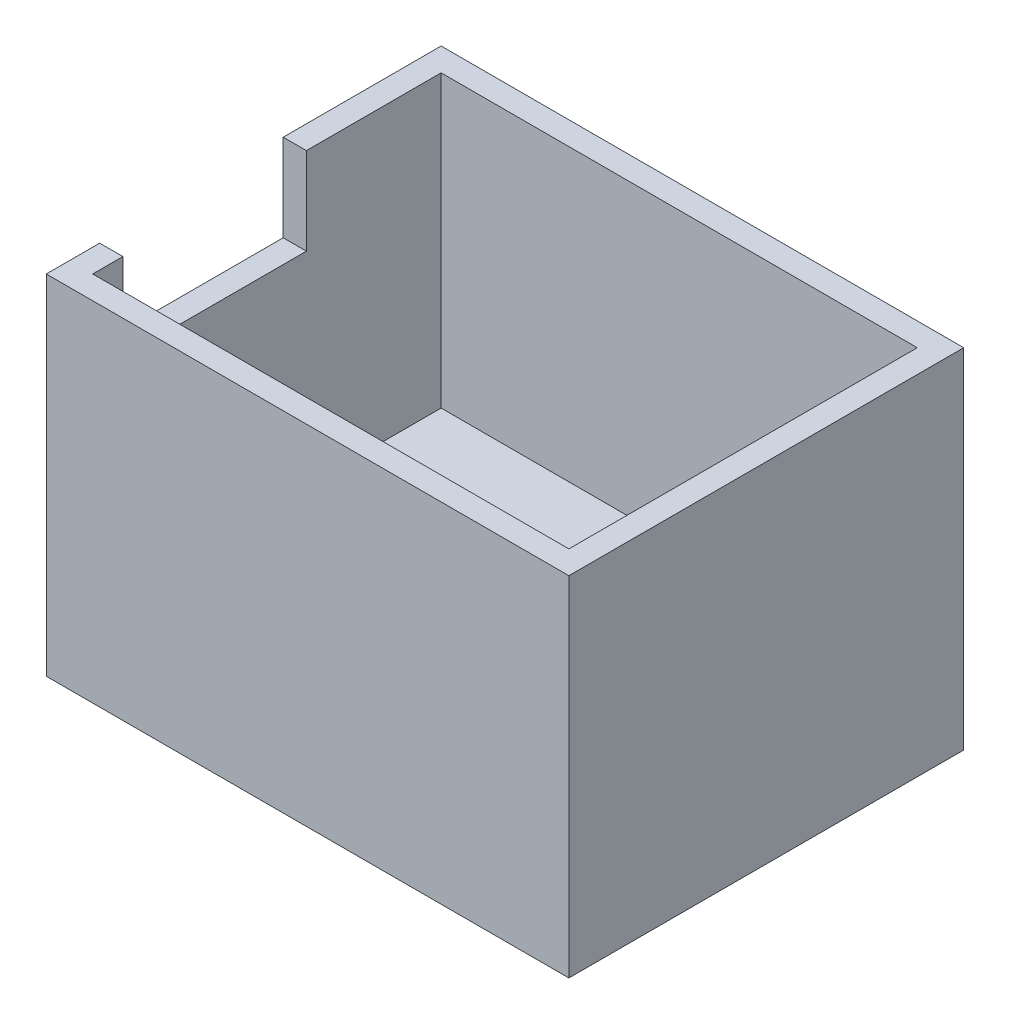
ISO-10303-21;
HEADER;
FILE_DESCRIPTION(('STEP AP214'),'2;1');
FILE_NAME('part.step','',(''),(''),'','','');
FILE_SCHEMA(('AUTOMOTIVE_DESIGN { 1 0 10303 214 1 1 1 1 }'));
ENDSEC;
DATA;
#1=APPLICATION_CONTEXT('core data for automotive mechanical design processes');
#2=APPLICATION_PROTOCOL_DEFINITION('international standard','automotive_design',2000,#1);
#3=PRODUCT_CONTEXT('',#1,'mechanical');
#4=PRODUCT('Part','Part','',(#3));
#5=PRODUCT_RELATED_PRODUCT_CATEGORY('part','',(#4));
#6=PRODUCT_DEFINITION_FORMATION('','',#4);
#7=PRODUCT_DEFINITION_CONTEXT('part definition',#1,'design');
#8=PRODUCT_DEFINITION('design','',#6,#7);
#9=PRODUCT_DEFINITION_SHAPE('','',#8);
#10=(LENGTH_UNIT() NAMED_UNIT(*) SI_UNIT(.MILLI.,.METRE.));
#11=(NAMED_UNIT(*) PLANE_ANGLE_UNIT() SI_UNIT($,.RADIAN.));
#12=(NAMED_UNIT(*) SI_UNIT($,.STERADIAN.) SOLID_ANGLE_UNIT());
#13=UNCERTAINTY_MEASURE_WITH_UNIT(LENGTH_MEASURE(1.E-05),#10,'distance_accuracy_value','');
#14=(GEOMETRIC_REPRESENTATION_CONTEXT(3) GLOBAL_UNCERTAINTY_ASSIGNED_CONTEXT((#13)) GLOBAL_UNIT_ASSIGNED_CONTEXT((#10,
#11,#12)) REPRESENTATION_CONTEXT('',''));
#15=CARTESIAN_POINT('',(0.,0.,0.));
#16=DIRECTION('',(0.,0.,1.));
#17=DIRECTION('',(1.,0.,0.));
#18=AXIS2_PLACEMENT_3D('',#15,#16,#17);
#19=CARTESIAN_POINT('',(28.575,38.1,21.59));
#20=DIRECTION('',(-1.,0.,0.));
#21=DIRECTION('',(0.,0.,1.));
#22=AXIS2_PLACEMENT_3D('',#19,#20,#21);
#23=PLANE('',#22);
#24=DIRECTION('',(0.,0.,-1.));
#25=VECTOR('',#24,1.);
#26=CARTESIAN_POINT('',(28.575,0.,21.59));
#27=LINE('',#26,#25);
#28=CARTESIAN_POINT('',(28.575,0.,21.59));
#29=VERTEX_POINT('',#28);
#30=CARTESIAN_POINT('',(28.575,0.,-21.59));
#31=VERTEX_POINT('',#30);
#32=EDGE_CURVE('E300',#29,#31,#27,.T.);
#33=ORIENTED_EDGE('',*,*,#32,.T.);
#34=DIRECTION('',(0.,-1.,0.));
#35=VECTOR('',#34,1.);
#36=CARTESIAN_POINT('',(28.575,38.1,-21.59));
#37=LINE('',#36,#35);
#38=CARTESIAN_POINT('',(28.575,38.1,-21.59));
#39=VERTEX_POINT('',#38);
#40=EDGE_CURVE('E335',#39,#31,#37,.T.);
#41=ORIENTED_EDGE('',*,*,#40,.F.);
#42=DIRECTION('',(0.,0.,-1.));
#43=VECTOR('',#42,1.);
#44=CARTESIAN_POINT('',(28.575,38.1,21.59));
#45=LINE('',#44,#43);
#46=CARTESIAN_POINT('',(28.575,38.1,21.59));
#47=VERTEX_POINT('',#46);
#48=EDGE_CURVE('E307',#47,#39,#45,.T.);
#49=ORIENTED_EDGE('',*,*,#48,.F.);
#50=DIRECTION('',(0.,-1.,0.));
#51=VECTOR('',#50,1.);
#52=CARTESIAN_POINT('',(28.575,38.1,21.59));
#53=LINE('',#52,#51);
#54=EDGE_CURVE('E319',#47,#29,#53,.T.);
#55=ORIENTED_EDGE('',*,*,#54,.T.);
#56=EDGE_LOOP('',(#33,#41,#49,#55));
#57=FACE_BOUND('',#56,.T.);
#58=ADVANCED_FACE('F34',(#57),#23,.F.);
#59=CARTESIAN_POINT('',(-28.575,38.1,-21.59));
#60=DIRECTION('',(0.,0.,1.));
#61=DIRECTION('',(1.,0.,0.));
#62=AXIS2_PLACEMENT_3D('',#59,#60,#61);
#63=PLANE('',#62);
#64=DIRECTION('',(-1.,0.,0.));
#65=VECTOR('',#64,1.);
#66=CARTESIAN_POINT('',(-28.575,0.,-21.59));
#67=LINE('',#66,#65);
#68=CARTESIAN_POINT('',(-28.575,0.,-21.59));
#69=VERTEX_POINT('',#68);
#70=EDGE_CURVE('E322',#31,#69,#67,.T.);
#71=ORIENTED_EDGE('',*,*,#70,.T.);
#72=DIRECTION('',(0.,-1.,0.));
#73=VECTOR('',#72,1.);
#74=CARTESIAN_POINT('',(-28.575,38.1,-21.59));
#75=LINE('',#74,#73);
#76=CARTESIAN_POINT('',(-28.575,38.1,-21.59));
#77=VERTEX_POINT('',#76);
#78=EDGE_CURVE('E332',#77,#69,#75,.T.);
#79=ORIENTED_EDGE('',*,*,#78,.F.);
#80=DIRECTION('',(-1.,0.,0.));
#81=VECTOR('',#80,1.);
#82=CARTESIAN_POINT('',(-28.575,38.1,-21.59));
#83=LINE('',#82,#81);
#84=EDGE_CURVE('E310',#39,#77,#83,.T.);
#85=ORIENTED_EDGE('',*,*,#84,.F.);
#86=ORIENTED_EDGE('',*,*,#40,.T.);
#87=EDGE_LOOP('',(#71,#79,#85,#86));
#88=FACE_BOUND('',#87,.T.);
#89=ADVANCED_FACE('F399',(#88),#63,.F.);
#90=CARTESIAN_POINT('',(-28.575,38.1,21.59));
#91=DIRECTION('',(1.,0.,0.));
#92=DIRECTION('',(0.,0.,-1.));
#93=AXIS2_PLACEMENT_3D('',#90,#91,#92);
#94=PLANE('',#93);
#95=DIRECTION('',(0.,0.,1.));
#96=VECTOR('',#95,1.);
#97=CARTESIAN_POINT('',(-28.575,38.1,21.59));
#98=LINE('',#97,#96);
#99=CARTESIAN_POINT('',(-28.575,38.1,15.748));
#100=VERTEX_POINT('',#99);
#101=CARTESIAN_POINT('',(-28.575,38.1,21.59));
#102=VERTEX_POINT('',#101);
#103=EDGE_CURVE('E313',#100,#102,#98,.T.);
#104=ORIENTED_EDGE('',*,*,#103,.F.);
#105=DIRECTION('',(0.,1.,0.));
#106=VECTOR('',#105,1.);
#107=CARTESIAN_POINT('',(-28.575,38.1,15.748));
#108=LINE('',#107,#106);
#109=CARTESIAN_POINT('',(-28.575,28.575,15.748));
#110=VERTEX_POINT('',#109);
#111=EDGE_CURVE('E235',#110,#100,#108,.T.);
#112=ORIENTED_EDGE('',*,*,#111,.F.);
#113=DIRECTION('',(0.,0.,1.));
#114=VECTOR('',#113,1.);
#115=CARTESIAN_POINT('',(-28.575,28.575,15.748));
#116=LINE('',#115,#114);
#117=CARTESIAN_POINT('',(-28.575,28.575,-4.318));
#118=VERTEX_POINT('',#117);
#119=EDGE_CURVE('E240',#118,#110,#116,.T.);
#120=ORIENTED_EDGE('',*,*,#119,.F.);
#121=DIRECTION('',(0.,-1.,0.));
#122=VECTOR('',#121,1.);
#123=CARTESIAN_POINT('',(-28.575,38.1,-4.318));
#124=LINE('',#123,#122);
#125=CARTESIAN_POINT('',(-28.575,38.1,-4.318));
#126=VERTEX_POINT('',#125);
#127=EDGE_CURVE('E237',#126,#118,#124,.T.);
#128=ORIENTED_EDGE('',*,*,#127,.F.);
#129=EDGE_CURVE('E314',#77,#126,#98,.T.);
#130=ORIENTED_EDGE('',*,*,#129,.F.);
#131=ORIENTED_EDGE('',*,*,#78,.T.);
#132=DIRECTION('',(0.,0.,1.));
#133=VECTOR('',#132,1.);
#134=CARTESIAN_POINT('',(-28.575,0.,21.59));
#135=LINE('',#134,#133);
#136=CARTESIAN_POINT('',(-28.575,0.,21.59));
#137=VERTEX_POINT('',#136);
#138=EDGE_CURVE('E324',#69,#137,#135,.T.);
#139=ORIENTED_EDGE('',*,*,#138,.T.);
#140=DIRECTION('',(0.,-1.,0.));
#141=VECTOR('',#140,1.);
#142=CARTESIAN_POINT('',(-28.575,38.1,21.59));
#143=LINE('',#142,#141);
#144=EDGE_CURVE('E329',#102,#137,#143,.T.);
#145=ORIENTED_EDGE('',*,*,#144,.F.);
#146=EDGE_LOOP('',(#104,#112,#120,#128,#130,#131,#139,#145));
#147=FACE_BOUND('',#146,.T.);
#148=ADVANCED_FACE('F404',(#147),#94,.F.);
#149=CARTESIAN_POINT('',(-28.575,38.1,21.59));
#150=DIRECTION('',(0.,0.,-1.));
#151=DIRECTION('',(-1.,0.,0.));
#152=AXIS2_PLACEMENT_3D('',#149,#150,#151);
#153=PLANE('',#152);
#154=DIRECTION('',(1.,0.,0.));
#155=VECTOR('',#154,1.);
#156=CARTESIAN_POINT('',(-28.575,0.,21.59));
#157=LINE('',#156,#155);
#158=EDGE_CURVE('E311',#137,#29,#157,.T.);
#159=ORIENTED_EDGE('',*,*,#158,.T.);
#160=ORIENTED_EDGE('',*,*,#54,.F.);
#161=DIRECTION('',(1.,0.,0.));
#162=VECTOR('',#161,1.);
#163=CARTESIAN_POINT('',(-28.575,38.1,21.59));
#164=LINE('',#163,#162);
#165=EDGE_CURVE('E317',#102,#47,#164,.T.);
#166=ORIENTED_EDGE('',*,*,#165,.F.);
#167=ORIENTED_EDGE('',*,*,#144,.T.);
#168=EDGE_LOOP('',(#159,#160,#166,#167));
#169=FACE_BOUND('',#168,.T.);
#170=ADVANCED_FACE('F422',(#169),#153,.F.);
#171=CARTESIAN_POINT('',(0.,38.1,0.));
#172=DIRECTION('',(0.,-1.,0.));
#173=DIRECTION('',(0.,0.,-1.));
#174=AXIS2_PLACEMENT_3D('',#171,#172,#173);
#175=PLANE('',#174);
#176=DIRECTION('',(0.,0.,1.));
#177=VECTOR('',#176,1.);
#178=CARTESIAN_POINT('',(-26.035,38.1,19.05));
#179=LINE('',#178,#177);
#180=CARTESIAN_POINT('',(-26.035,38.1,15.748));
#181=VERTEX_POINT('',#180);
#182=CARTESIAN_POINT('',(-26.035,38.1,19.05));
#183=VERTEX_POINT('',#182);
#184=EDGE_CURVE('E266',#181,#183,#179,.T.);
#185=ORIENTED_EDGE('',*,*,#184,.F.);
#186=DIRECTION('',(-1.,0.,0.));
#187=VECTOR('',#186,1.);
#188=CARTESIAN_POINT('',(28.576,38.1,15.748));
#189=LINE('',#188,#187);
#190=EDGE_CURVE('E243',#181,#100,#189,.T.);
#191=ORIENTED_EDGE('',*,*,#190,.T.);
#192=ORIENTED_EDGE('',*,*,#103,.T.);
#193=ORIENTED_EDGE('',*,*,#165,.T.);
#194=ORIENTED_EDGE('',*,*,#48,.T.);
#195=ORIENTED_EDGE('',*,*,#84,.T.);
#196=ORIENTED_EDGE('',*,*,#129,.T.);
#197=DIRECTION('',(-1.,0.,0.));
#198=VECTOR('',#197,1.);
#199=CARTESIAN_POINT('',(28.576,38.1,-4.318));
#200=LINE('',#199,#198);
#201=CARTESIAN_POINT('',(-26.035,38.1,-4.318));
#202=VERTEX_POINT('',#201);
#203=EDGE_CURVE('E249',#202,#126,#200,.T.);
#204=ORIENTED_EDGE('',*,*,#203,.F.);
#205=CARTESIAN_POINT('',(-26.035,38.1,-19.05));
#206=VERTEX_POINT('',#205);
#207=EDGE_CURVE('E287',#206,#202,#179,.T.);
#208=ORIENTED_EDGE('',*,*,#207,.F.);
#209=DIRECTION('',(-1.,0.,0.));
#210=VECTOR('',#209,1.);
#211=CARTESIAN_POINT('',(26.035,38.1,-19.05));
#212=LINE('',#211,#210);
#213=CARTESIAN_POINT('',(26.035,38.1,-19.05));
#214=VERTEX_POINT('',#213);
#215=EDGE_CURVE('E277',#214,#206,#212,.T.);
#216=ORIENTED_EDGE('',*,*,#215,.F.);
#217=DIRECTION('',(0.,0.,-1.));
#218=VECTOR('',#217,1.);
#219=CARTESIAN_POINT('',(26.035,38.1,19.05));
#220=LINE('',#219,#218);
#221=CARTESIAN_POINT('',(26.035,38.1,19.05));
#222=VERTEX_POINT('',#221);
#223=EDGE_CURVE('E293',#222,#214,#220,.T.);
#224=ORIENTED_EDGE('',*,*,#223,.F.);
#225=DIRECTION('',(1.,0.,0.));
#226=VECTOR('',#225,1.);
#227=CARTESIAN_POINT('',(26.035,38.1,19.05));
#228=LINE('',#227,#226);
#229=EDGE_CURVE('E290',#183,#222,#228,.T.);
#230=ORIENTED_EDGE('',*,*,#229,.F.);
#231=EDGE_LOOP('',(#185,#191,#192,#193,#194,#195,#196,#204,#208,#216,#224,#230));
#232=FACE_BOUND('',#231,.T.);
#233=ADVANCED_FACE('F417',(#232),#175,.F.);
#234=CARTESIAN_POINT('',(0.,0.,0.));
#235=DIRECTION('',(0.,-1.,0.));
#236=DIRECTION('',(0.,0.,-1.));
#237=AXIS2_PLACEMENT_3D('',#234,#235,#236);
#238=PLANE('',#237);
#239=CARTESIAN_POINT('',(-3.175,0.,-14.605));
#240=DIRECTION('',(0.,-1.,0.));
#241=DIRECTION('',(0.,0.,-1.));
#242=AXIS2_PLACEMENT_3D('',#239,#240,#241);
#243=CIRCLE('',#242,1.82879999999999);
#244=CARTESIAN_POINT('',(-3.175,0.,-16.4338));
#245=VERTEX_POINT('',#244);
#246=EDGE_CURVE('E364',#245,#245,#243,.T.);
#247=ORIENTED_EDGE('',*,*,#246,.F.);
#248=EDGE_LOOP('',(#247));
#249=FACE_BOUND('',#248,.T.);
#250=CARTESIAN_POINT('',(-3.175,0.,14.605));
#251=DIRECTION('',(0.,-1.,0.));
#252=DIRECTION('',(0.,0.,-1.));
#253=AXIS2_PLACEMENT_3D('',#250,#251,#252);
#254=CIRCLE('',#253,1.82879999999999);
#255=CARTESIAN_POINT('',(-3.175,0.,12.7762));
#256=VERTEX_POINT('',#255);
#257=EDGE_CURVE('E354',#256,#256,#254,.T.);
#258=ORIENTED_EDGE('',*,*,#257,.F.);
#259=EDGE_LOOP('',(#258));
#260=FACE_BOUND('',#259,.T.);
#261=CARTESIAN_POINT('',(19.656947542752,0.,-16.256));
#262=DIRECTION('',(0.,-1.,0.));
#263=DIRECTION('',(0.,0.,-1.));
#264=AXIS2_PLACEMENT_3D('',#261,#262,#263);
#265=CIRCLE('',#264,1.47319999999999);
#266=CARTESIAN_POINT('',(19.656947542752,0.,-17.7292));
#267=VERTEX_POINT('',#266);
#268=EDGE_CURVE('E351',#267,#267,#265,.T.);
#269=ORIENTED_EDGE('',*,*,#268,.F.);
#270=EDGE_LOOP('',(#269));
#271=FACE_BOUND('',#270,.T.);
#272=CARTESIAN_POINT('',(19.656947542752,0.,16.256));
#273=DIRECTION('',(0.,-1.,0.));
#274=DIRECTION('',(0.,0.,-1.));
#275=AXIS2_PLACEMENT_3D('',#272,#273,#274);
#276=CIRCLE('',#275,1.47319999999999);
#277=CARTESIAN_POINT('',(19.656947542752,0.,14.7828));
#278=VERTEX_POINT('',#277);
#279=EDGE_CURVE('E348',#278,#278,#276,.T.);
#280=ORIENTED_EDGE('',*,*,#279,.F.);
#281=EDGE_LOOP('',(#280));
#282=FACE_BOUND('',#281,.T.);
#283=DIRECTION('',(0.,0.,1.));
#284=VECTOR('',#283,1.);
#285=CARTESIAN_POINT('',(24.228947542752,0.,-13.716));
#286=LINE('',#285,#284);
#287=CARTESIAN_POINT('',(24.228947542752,0.,-13.716));
#288=VERTEX_POINT('',#287);
#289=CARTESIAN_POINT('',(24.228947542752,0.,13.716));
#290=VERTEX_POINT('',#289);
#291=EDGE_CURVE('E50',#288,#290,#286,.T.);
#292=ORIENTED_EDGE('',*,*,#291,.F.);
#293=DIRECTION('',(1.,0.,0.));
#294=VECTOR('',#293,1.);
#295=CARTESIAN_POINT('',(17.624947542752,0.,-13.716));
#296=LINE('',#295,#294);
#297=CARTESIAN_POINT('',(17.624947542752,0.,-13.716));
#298=VERTEX_POINT('',#297);
#299=EDGE_CURVE('E195',#298,#288,#296,.T.);
#300=ORIENTED_EDGE('',*,*,#299,.F.);
#301=CARTESIAN_POINT('',(17.624947542752,0.,-11.176));
#302=DIRECTION('',(0.,-1.,0.));
#303=DIRECTION('',(0.,0.,-1.));
#304=AXIS2_PLACEMENT_3D('',#301,#302,#303);
#305=CIRCLE('',#304,2.54);
#306=CARTESIAN_POINT('',(15.084947542752,0.,-11.176));
#307=VERTEX_POINT('',#306);
#308=EDGE_CURVE('E216',#307,#298,#305,.T.);
#309=ORIENTED_EDGE('',*,*,#308,.F.);
#310=DIRECTION('',(0.,0.,-1.));
#311=VECTOR('',#310,1.);
#312=CARTESIAN_POINT('',(15.084947542752,0.,-11.176));
#313=LINE('',#312,#311);
#314=CARTESIAN_POINT('',(15.084947542752,0.,11.176));
#315=VERTEX_POINT('',#314);
#316=EDGE_CURVE('E213',#315,#307,#313,.T.);
#317=ORIENTED_EDGE('',*,*,#316,.F.);
#318=CARTESIAN_POINT('',(17.624947542752,0.,11.176));
#319=DIRECTION('',(0.,-1.,0.));
#320=DIRECTION('',(0.,0.,1.));
#321=AXIS2_PLACEMENT_3D('',#318,#319,#320);
#322=CIRCLE('',#321,2.54);
#323=CARTESIAN_POINT('',(17.624947542752,0.,13.716));
#324=VERTEX_POINT('',#323);
#325=EDGE_CURVE('E210',#324,#315,#322,.T.);
#326=ORIENTED_EDGE('',*,*,#325,.F.);
#327=DIRECTION('',(-1.,0.,0.));
#328=VECTOR('',#327,1.);
#329=CARTESIAN_POINT('',(17.624947542752,0.,13.716));
#330=LINE('',#329,#328);
#331=EDGE_CURVE('E203',#290,#324,#330,.T.);
#332=ORIENTED_EDGE('',*,*,#331,.F.);
#333=EDGE_LOOP('',(#292,#300,#309,#317,#326,#332));
#334=FACE_BOUND('',#333,.T.);
#335=DIRECTION('',(0.,0.,1.));
#336=VECTOR('',#335,1.);
#337=CARTESIAN_POINT('',(10.541,0.,7.62000000000001));
#338=LINE('',#337,#336);
#339=CARTESIAN_POINT('',(10.541,0.,-7.61999999999999));
#340=VERTEX_POINT('',#339);
#341=CARTESIAN_POINT('',(10.541,0.,7.62000000000001));
#342=VERTEX_POINT('',#341);
#343=EDGE_CURVE('E246',#340,#342,#338,.T.);
#344=ORIENTED_EDGE('',*,*,#343,.F.);
#345=DIRECTION('',(1.,0.,0.));
#346=VECTOR('',#345,1.);
#347=CARTESIAN_POINT('',(-7.49299999999999,0.,-7.61999999999999));
#348=LINE('',#347,#346);
#349=CARTESIAN_POINT('',(-7.49299999999999,0.,-7.61999999999999));
#350=VERTEX_POINT('',#349);
#351=EDGE_CURVE('E260',#350,#340,#348,.T.);
#352=ORIENTED_EDGE('',*,*,#351,.F.);
#353=DIRECTION('',(0.,0.,-1.));
#354=VECTOR('',#353,1.);
#355=CARTESIAN_POINT('',(-7.49299999999999,0.,7.62));
#356=LINE('',#355,#354);
#357=CARTESIAN_POINT('',(-7.49299999999999,0.,7.62));
#358=VERTEX_POINT('',#357);
#359=EDGE_CURVE('E257',#358,#350,#356,.T.);
#360=ORIENTED_EDGE('',*,*,#359,.F.);
#361=DIRECTION('',(-1.,0.,0.));
#362=VECTOR('',#361,1.);
#363=CARTESIAN_POINT('',(-7.49299999999999,0.,7.62));
#364=LINE('',#363,#362);
#365=EDGE_CURVE('E254',#342,#358,#364,.T.);
#366=ORIENTED_EDGE('',*,*,#365,.F.);
#367=EDGE_LOOP('',(#344,#352,#360,#366));
#368=FACE_BOUND('',#367,.T.);
#369=ORIENTED_EDGE('',*,*,#32,.F.);
#370=ORIENTED_EDGE('',*,*,#158,.F.);
#371=ORIENTED_EDGE('',*,*,#138,.F.);
#372=ORIENTED_EDGE('',*,*,#70,.F.);
#373=EDGE_LOOP('',(#369,#370,#371,#372));
#374=FACE_BOUND('',#373,.T.);
#375=ADVANCED_FACE('F384',(#249,#260,#271,#282,#334,#368,#374),#238,.T.);
#376=CARTESIAN_POINT('',(-26.035,6.35,19.05));
#377=DIRECTION('',(-1.,0.,0.));
#378=DIRECTION('',(0.,0.,1.));
#379=AXIS2_PLACEMENT_3D('',#376,#377,#378);
#380=PLANE('',#379);
#381=DIRECTION('',(0.,0.,-1.));
#382=VECTOR('',#381,1.);
#383=CARTESIAN_POINT('',(-26.035,28.575,15.748));
#384=LINE('',#383,#382);
#385=CARTESIAN_POINT('',(-26.035,28.575,15.748));
#386=VERTEX_POINT('',#385);
#387=CARTESIAN_POINT('',(-26.035,28.575,-4.318));
#388=VERTEX_POINT('',#387);
#389=EDGE_CURVE('E230',#386,#388,#384,.T.);
#390=ORIENTED_EDGE('',*,*,#389,.F.);
#391=DIRECTION('',(0.,-1.,0.));
#392=VECTOR('',#391,1.);
#393=CARTESIAN_POINT('',(-26.035,38.1,15.748));
#394=LINE('',#393,#392);
#395=EDGE_CURVE('E232',#181,#386,#394,.T.);
#396=ORIENTED_EDGE('',*,*,#395,.F.);
#397=ORIENTED_EDGE('',*,*,#184,.T.);
#398=DIRECTION('',(0.,1.,0.));
#399=VECTOR('',#398,1.);
#400=CARTESIAN_POINT('',(-26.035,6.35,19.05));
#401=LINE('',#400,#399);
#402=CARTESIAN_POINT('',(-26.035,6.35,19.05));
#403=VERTEX_POINT('',#402);
#404=EDGE_CURVE('E286',#403,#183,#401,.T.);
#405=ORIENTED_EDGE('',*,*,#404,.F.);
#406=DIRECTION('',(0.,0.,1.));
#407=VECTOR('',#406,1.);
#408=CARTESIAN_POINT('',(-26.035,6.35,19.05));
#409=LINE('',#408,#407);
#410=CARTESIAN_POINT('',(-26.035,6.35,-19.05));
#411=VERTEX_POINT('',#410);
#412=EDGE_CURVE('E273',#411,#403,#409,.T.);
#413=ORIENTED_EDGE('',*,*,#412,.F.);
#414=DIRECTION('',(0.,1.,0.));
#415=VECTOR('',#414,1.);
#416=CARTESIAN_POINT('',(-26.035,6.35,-19.05));
#417=LINE('',#416,#415);
#418=EDGE_CURVE('E298',#411,#206,#417,.T.);
#419=ORIENTED_EDGE('',*,*,#418,.T.);
#420=ORIENTED_EDGE('',*,*,#207,.T.);
#421=DIRECTION('',(0.,1.,0.));
#422=VECTOR('',#421,1.);
#423=CARTESIAN_POINT('',(-26.035,38.1,-4.318));
#424=LINE('',#423,#422);
#425=EDGE_CURVE('E189',#388,#202,#424,.T.);
#426=ORIENTED_EDGE('',*,*,#425,.F.);
#427=EDGE_LOOP('',(#390,#396,#397,#405,#413,#419,#420,#426));
#428=FACE_BOUND('',#427,.T.);
#429=ADVANCED_FACE('F434',(#428),#380,.F.);
#430=CARTESIAN_POINT('',(26.035,6.35,-19.05));
#431=DIRECTION('',(0.,0.,-1.));
#432=DIRECTION('',(-1.,0.,0.));
#433=AXIS2_PLACEMENT_3D('',#430,#431,#432);
#434=PLANE('',#433);
#435=ORIENTED_EDGE('',*,*,#215,.T.);
#436=ORIENTED_EDGE('',*,*,#418,.F.);
#437=DIRECTION('',(-1.,0.,0.));
#438=VECTOR('',#437,1.);
#439=CARTESIAN_POINT('',(26.035,6.35,-19.05));
#440=LINE('',#439,#438);
#441=CARTESIAN_POINT('',(26.035,6.35,-19.05));
#442=VERTEX_POINT('',#441);
#443=EDGE_CURVE('E283',#442,#411,#440,.T.);
#444=ORIENTED_EDGE('',*,*,#443,.F.);
#445=DIRECTION('',(0.,1.,0.));
#446=VECTOR('',#445,1.);
#447=CARTESIAN_POINT('',(26.035,6.35,-19.05));
#448=LINE('',#447,#446);
#449=EDGE_CURVE('E301',#442,#214,#448,.T.);
#450=ORIENTED_EDGE('',*,*,#449,.T.);
#451=EDGE_LOOP('',(#435,#436,#444,#450));
#452=FACE_BOUND('',#451,.T.);
#453=ADVANCED_FACE('F438',(#452),#434,.F.);
#454=CARTESIAN_POINT('',(26.035,6.35,19.05));
#455=DIRECTION('',(1.,0.,0.));
#456=DIRECTION('',(0.,0.,-1.));
#457=AXIS2_PLACEMENT_3D('',#454,#455,#456);
#458=PLANE('',#457);
#459=ORIENTED_EDGE('',*,*,#223,.T.);
#460=ORIENTED_EDGE('',*,*,#449,.F.);
#461=DIRECTION('',(0.,0.,-1.));
#462=VECTOR('',#461,1.);
#463=CARTESIAN_POINT('',(26.035,6.35,19.05));
#464=LINE('',#463,#462);
#465=CARTESIAN_POINT('',(26.035,6.35,19.05));
#466=VERTEX_POINT('',#465);
#467=EDGE_CURVE('E280',#466,#442,#464,.T.);
#468=ORIENTED_EDGE('',*,*,#467,.F.);
#469=DIRECTION('',(0.,1.,0.));
#470=VECTOR('',#469,1.);
#471=CARTESIAN_POINT('',(26.035,6.35,19.05));
#472=LINE('',#471,#470);
#473=EDGE_CURVE('E303',#466,#222,#472,.T.);
#474=ORIENTED_EDGE('',*,*,#473,.T.);
#475=EDGE_LOOP('',(#459,#460,#468,#474));
#476=FACE_BOUND('',#475,.T.);
#477=ADVANCED_FACE('F442',(#476),#458,.F.);
#478=CARTESIAN_POINT('',(26.035,6.35,19.05));
#479=DIRECTION('',(0.,0.,1.));
#480=DIRECTION('',(1.,0.,0.));
#481=AXIS2_PLACEMENT_3D('',#478,#479,#480);
#482=PLANE('',#481);
#483=ORIENTED_EDGE('',*,*,#229,.T.);
#484=ORIENTED_EDGE('',*,*,#473,.F.);
#485=DIRECTION('',(1.,0.,0.));
#486=VECTOR('',#485,1.);
#487=CARTESIAN_POINT('',(26.035,6.35,19.05));
#488=LINE('',#487,#486);
#489=EDGE_CURVE('E276',#403,#466,#488,.T.);
#490=ORIENTED_EDGE('',*,*,#489,.F.);
#491=ORIENTED_EDGE('',*,*,#404,.T.);
#492=EDGE_LOOP('',(#483,#484,#490,#491));
#493=FACE_BOUND('',#492,.T.);
#494=ADVANCED_FACE('F446',(#493),#482,.F.);
#495=CARTESIAN_POINT('',(0.,6.35,0.));
#496=DIRECTION('',(0.,1.,0.));
#497=DIRECTION('',(0.,0.,1.));
#498=AXIS2_PLACEMENT_3D('',#495,#496,#497);
#499=PLANE('',#498);
#500=CARTESIAN_POINT('',(-3.175,6.35,-14.605));
#501=DIRECTION('',(0.,1.,0.));
#502=DIRECTION('',(0.,0.,1.));
#503=AXIS2_PLACEMENT_3D('',#500,#501,#502);
#504=CIRCLE('',#503,1.82879999999999);
#505=CARTESIAN_POINT('',(-3.175,6.35,-12.7762));
#506=VERTEX_POINT('',#505);
#507=EDGE_CURVE('E37',#506,#506,#504,.T.);
#508=ORIENTED_EDGE('',*,*,#507,.F.);
#509=EDGE_LOOP('',(#508));
#510=FACE_BOUND('',#509,.T.);
#511=CARTESIAN_POINT('',(-3.175,6.35,14.605));
#512=DIRECTION('',(0.,1.,0.));
#513=DIRECTION('',(0.,0.,1.));
#514=AXIS2_PLACEMENT_3D('',#511,#512,#513);
#515=CIRCLE('',#514,1.82879999999999);
#516=CARTESIAN_POINT('',(-3.175,6.35,16.4338));
#517=VERTEX_POINT('',#516);
#518=EDGE_CURVE('E352',#517,#517,#515,.T.);
#519=ORIENTED_EDGE('',*,*,#518,.F.);
#520=EDGE_LOOP('',(#519));
#521=FACE_BOUND('',#520,.T.);
#522=CARTESIAN_POINT('',(19.656947542752,6.35,-16.256));
#523=DIRECTION('',(0.,1.,0.));
#524=DIRECTION('',(0.,0.,1.));
#525=AXIS2_PLACEMENT_3D('',#522,#523,#524);
#526=CIRCLE('',#525,1.47319999999999);
#527=CARTESIAN_POINT('',(19.656947542752,6.35,-14.7828));
#528=VERTEX_POINT('',#527);
#529=EDGE_CURVE('E349',#528,#528,#526,.T.);
#530=ORIENTED_EDGE('',*,*,#529,.F.);
#531=EDGE_LOOP('',(#530));
#532=FACE_BOUND('',#531,.T.);
#533=CARTESIAN_POINT('',(19.656947542752,6.35,16.256));
#534=DIRECTION('',(0.,1.,0.));
#535=DIRECTION('',(0.,0.,1.));
#536=AXIS2_PLACEMENT_3D('',#533,#534,#535);
#537=CIRCLE('',#536,1.47319999999999);
#538=CARTESIAN_POINT('',(19.656947542752,6.35,17.7292));
#539=VERTEX_POINT('',#538);
#540=EDGE_CURVE('E344',#539,#539,#537,.T.);
#541=ORIENTED_EDGE('',*,*,#540,.F.);
#542=EDGE_LOOP('',(#541));
#543=FACE_BOUND('',#542,.T.);
#544=DIRECTION('',(0.,0.,1.));
#545=VECTOR('',#544,1.);
#546=CARTESIAN_POINT('',(24.228947542752,6.35,-13.716));
#547=LINE('',#546,#545);
#548=CARTESIAN_POINT('',(24.228947542752,6.35,-13.716));
#549=VERTEX_POINT('',#548);
#550=CARTESIAN_POINT('',(24.228947542752,6.35,13.716));
#551=VERTEX_POINT('',#550);
#552=EDGE_CURVE('E193',#549,#551,#547,.T.);
#553=ORIENTED_EDGE('',*,*,#552,.T.);
#554=DIRECTION('',(-1.,0.,0.));
#555=VECTOR('',#554,1.);
#556=CARTESIAN_POINT('',(17.624947542752,6.35,13.716));
#557=LINE('',#556,#555);
#558=CARTESIAN_POINT('',(17.624947542752,6.35,13.716));
#559=VERTEX_POINT('',#558);
#560=EDGE_CURVE('E182',#551,#559,#557,.T.);
#561=ORIENTED_EDGE('',*,*,#560,.T.);
#562=CARTESIAN_POINT('',(17.624947542752,6.35,11.176));
#563=DIRECTION('',(0.,1.,0.));
#564=DIRECTION('',(0.,0.,1.));
#565=AXIS2_PLACEMENT_3D('',#562,#563,#564);
#566=CIRCLE('',#565,2.54);
#567=CARTESIAN_POINT('',(15.084947542752,6.35,11.176));
#568=VERTEX_POINT('',#567);
#569=EDGE_CURVE('E347',#559,#568,#566,.F.);
#570=ORIENTED_EDGE('',*,*,#569,.T.);
#571=DIRECTION('',(0.,0.,-1.));
#572=VECTOR('',#571,1.);
#573=CARTESIAN_POINT('',(15.084947542752,6.35,-11.176));
#574=LINE('',#573,#572);
#575=CARTESIAN_POINT('',(15.084947542752,6.35,-11.176));
#576=VERTEX_POINT('',#575);
#577=EDGE_CURVE('E370',#568,#576,#574,.T.);
#578=ORIENTED_EDGE('',*,*,#577,.T.);
#579=CARTESIAN_POINT('',(17.624947542752,6.35,-11.176));
#580=DIRECTION('',(0.,1.,0.));
#581=DIRECTION('',(0.,0.,1.));
#582=AXIS2_PLACEMENT_3D('',#579,#580,#581);
#583=CIRCLE('',#582,2.54);
#584=CARTESIAN_POINT('',(17.624947542752,6.35,-13.716));
#585=VERTEX_POINT('',#584);
#586=EDGE_CURVE('E205',#576,#585,#583,.F.);
#587=ORIENTED_EDGE('',*,*,#586,.T.);
#588=DIRECTION('',(1.,0.,0.));
#589=VECTOR('',#588,1.);
#590=CARTESIAN_POINT('',(17.624947542752,6.35,-13.716));
#591=LINE('',#590,#589);
#592=EDGE_CURVE('E201',#585,#549,#591,.T.);
#593=ORIENTED_EDGE('',*,*,#592,.T.);
#594=EDGE_LOOP('',(#553,#561,#570,#578,#587,#593));
#595=FACE_BOUND('',#594,.T.);
#596=DIRECTION('',(0.,0.,-1.));
#597=VECTOR('',#596,1.);
#598=CARTESIAN_POINT('',(10.541,6.35,0.));
#599=LINE('',#598,#597);
#600=CARTESIAN_POINT('',(10.541,6.35000000000002,7.62000000000001));
#601=VERTEX_POINT('',#600);
#602=CARTESIAN_POINT('',(10.541,6.35000000000002,-7.61999999999999));
#603=VERTEX_POINT('',#602);
#604=EDGE_CURVE('E11',#601,#603,#599,.T.);
#605=ORIENTED_EDGE('',*,*,#604,.F.);
#606=DIRECTION('',(1.,0.,0.));
#607=VECTOR('',#606,1.);
#608=CARTESIAN_POINT('',(0.,6.35,7.62000000000001));
#609=LINE('',#608,#607);
#610=CARTESIAN_POINT('',(-7.49299999999999,6.35,7.62));
#611=VERTEX_POINT('',#610);
#612=EDGE_CURVE('E338',#611,#601,#609,.T.);
#613=ORIENTED_EDGE('',*,*,#612,.F.);
#614=DIRECTION('',(0.,0.,1.));
#615=VECTOR('',#614,1.);
#616=CARTESIAN_POINT('',(-7.49299999999999,6.35,0.));
#617=LINE('',#616,#615);
#618=CARTESIAN_POINT('',(-7.49299999999999,6.35000000000002,-7.61999999999999));
#619=VERTEX_POINT('',#618);
#620=EDGE_CURVE('E340',#619,#611,#617,.T.);
#621=ORIENTED_EDGE('',*,*,#620,.F.);
#622=DIRECTION('',(-1.,0.,0.));
#623=VECTOR('',#622,1.);
#624=CARTESIAN_POINT('',(0.,6.35,-7.61999999999999));
#625=LINE('',#624,#623);
#626=EDGE_CURVE('E42',#603,#619,#625,.T.);
#627=ORIENTED_EDGE('',*,*,#626,.F.);
#628=EDGE_LOOP('',(#605,#613,#621,#627));
#629=FACE_BOUND('',#628,.T.);
#630=ORIENTED_EDGE('',*,*,#412,.T.);
#631=ORIENTED_EDGE('',*,*,#489,.T.);
#632=ORIENTED_EDGE('',*,*,#467,.T.);
#633=ORIENTED_EDGE('',*,*,#443,.T.);
#634=EDGE_LOOP('',(#630,#631,#632,#633));
#635=FACE_BOUND('',#634,.T.);
#636=ADVANCED_FACE('F198',(#510,#521,#532,#543,#595,#629,#635),#499,.T.);
#637=CARTESIAN_POINT('',(10.541,38.1,7.62000000000001));
#638=DIRECTION('',(1.,0.,0.));
#639=DIRECTION('',(0.,0.,-1.));
#640=AXIS2_PLACEMENT_3D('',#637,#638,#639);
#641=PLANE('',#640);
#642=ORIENTED_EDGE('',*,*,#604,.T.);
#643=DIRECTION('',(0.,-1.,0.));
#644=VECTOR('',#643,1.);
#645=CARTESIAN_POINT('',(10.541,38.1,-7.61999999999999));
#646=LINE('',#645,#644);
#647=EDGE_CURVE('E264',#603,#340,#646,.T.);
#648=ORIENTED_EDGE('',*,*,#647,.T.);
#649=ORIENTED_EDGE('',*,*,#343,.T.);
#650=DIRECTION('',(0.,-1.,0.));
#651=VECTOR('',#650,1.);
#652=CARTESIAN_POINT('',(10.541,38.1,7.62000000000001));
#653=LINE('',#652,#651);
#654=EDGE_CURVE('E263',#601,#342,#653,.T.);
#655=ORIENTED_EDGE('',*,*,#654,.F.);
#656=EDGE_LOOP('',(#642,#648,#649,#655));
#657=FACE_BOUND('',#656,.T.);
#658=ADVANCED_FACE('F467',(#657),#641,.F.);
#659=CARTESIAN_POINT('',(-7.49299999999999,38.1,-7.61999999999999));
#660=DIRECTION('',(0.,0.,-1.));
#661=DIRECTION('',(-1.,0.,0.));
#662=AXIS2_PLACEMENT_3D('',#659,#660,#661);
#663=PLANE('',#662);
#664=ORIENTED_EDGE('',*,*,#626,.T.);
#665=DIRECTION('',(0.,-1.,0.));
#666=VECTOR('',#665,1.);
#667=CARTESIAN_POINT('',(-7.49299999999999,38.1,-7.61999999999999));
#668=LINE('',#667,#666);
#669=EDGE_CURVE('E267',#619,#350,#668,.T.);
#670=ORIENTED_EDGE('',*,*,#669,.T.);
#671=ORIENTED_EDGE('',*,*,#351,.T.);
#672=ORIENTED_EDGE('',*,*,#647,.F.);
#673=EDGE_LOOP('',(#664,#670,#671,#672));
#674=FACE_BOUND('',#673,.T.);
#675=ADVANCED_FACE('F463',(#674),#663,.F.);
#676=CARTESIAN_POINT('',(-7.49299999999999,38.1,7.62));
#677=DIRECTION('',(-1.,0.,0.));
#678=DIRECTION('',(0.,0.,1.));
#679=AXIS2_PLACEMENT_3D('',#676,#677,#678);
#680=PLANE('',#679);
#681=ORIENTED_EDGE('',*,*,#620,.T.);
#682=DIRECTION('',(0.,-1.,0.));
#683=VECTOR('',#682,1.);
#684=CARTESIAN_POINT('',(-7.49299999999999,38.1,7.62));
#685=LINE('',#684,#683);
#686=EDGE_CURVE('E269',#611,#358,#685,.T.);
#687=ORIENTED_EDGE('',*,*,#686,.T.);
#688=ORIENTED_EDGE('',*,*,#359,.T.);
#689=ORIENTED_EDGE('',*,*,#669,.F.);
#690=EDGE_LOOP('',(#681,#687,#688,#689));
#691=FACE_BOUND('',#690,.T.);
#692=ADVANCED_FACE('F466',(#691),#680,.F.);
#693=CARTESIAN_POINT('',(-7.49299999999999,38.1,7.62));
#694=DIRECTION('',(0.,0.,1.));
#695=DIRECTION('',(1.,0.,0.));
#696=AXIS2_PLACEMENT_3D('',#693,#694,#695);
#697=PLANE('',#696);
#698=ORIENTED_EDGE('',*,*,#612,.T.);
#699=ORIENTED_EDGE('',*,*,#654,.T.);
#700=ORIENTED_EDGE('',*,*,#365,.T.);
#701=ORIENTED_EDGE('',*,*,#686,.F.);
#702=EDGE_LOOP('',(#698,#699,#700,#701));
#703=FACE_BOUND('',#702,.T.);
#704=ADVANCED_FACE('F462',(#703),#697,.F.);
#705=CARTESIAN_POINT('',(28.576,38.1,15.748));
#706=DIRECTION('',(0.,0.,1.));
#707=DIRECTION('',(1.,0.,0.));
#708=AXIS2_PLACEMENT_3D('',#705,#706,#707);
#709=PLANE('',#708);
#710=ORIENTED_EDGE('',*,*,#395,.T.);
#711=DIRECTION('',(-1.,0.,0.));
#712=VECTOR('',#711,1.);
#713=CARTESIAN_POINT('',(28.576,28.575,15.748));
#714=LINE('',#713,#712);
#715=EDGE_CURVE('E244',#386,#110,#714,.T.);
#716=ORIENTED_EDGE('',*,*,#715,.T.);
#717=ORIENTED_EDGE('',*,*,#111,.T.);
#718=ORIENTED_EDGE('',*,*,#190,.F.);
#719=EDGE_LOOP('',(#710,#716,#717,#718));
#720=FACE_BOUND('',#719,.T.);
#721=ADVANCED_FACE('F449',(#720),#709,.F.);
#722=CARTESIAN_POINT('',(28.576,28.575,15.748));
#723=DIRECTION('',(0.,-1.,0.));
#724=DIRECTION('',(0.,0.,-1.));
#725=AXIS2_PLACEMENT_3D('',#722,#723,#724);
#726=PLANE('',#725);
#727=ORIENTED_EDGE('',*,*,#389,.T.);
#728=DIRECTION('',(-1.,0.,0.));
#729=VECTOR('',#728,1.);
#730=CARTESIAN_POINT('',(28.576,28.575,-4.318));
#731=LINE('',#730,#729);
#732=EDGE_CURVE('E247',#388,#118,#731,.T.);
#733=ORIENTED_EDGE('',*,*,#732,.T.);
#734=ORIENTED_EDGE('',*,*,#119,.T.);
#735=ORIENTED_EDGE('',*,*,#715,.F.);
#736=EDGE_LOOP('',(#727,#733,#734,#735));
#737=FACE_BOUND('',#736,.T.);
#738=ADVANCED_FACE('F451',(#737),#726,.F.);
#739=CARTESIAN_POINT('',(28.576,38.1,-4.318));
#740=DIRECTION('',(0.,0.,-1.));
#741=DIRECTION('',(-1.,0.,0.));
#742=AXIS2_PLACEMENT_3D('',#739,#740,#741);
#743=PLANE('',#742);
#744=ORIENTED_EDGE('',*,*,#425,.T.);
#745=ORIENTED_EDGE('',*,*,#203,.T.);
#746=ORIENTED_EDGE('',*,*,#127,.T.);
#747=ORIENTED_EDGE('',*,*,#732,.F.);
#748=EDGE_LOOP('',(#744,#745,#746,#747));
#749=FACE_BOUND('',#748,.T.);
#750=ADVANCED_FACE('F395',(#749),#743,.F.);
#751=CARTESIAN_POINT('',(24.228947542752,38.101,-13.716));
#752=DIRECTION('',(1.,0.,0.));
#753=DIRECTION('',(0.,0.,-1.));
#754=AXIS2_PLACEMENT_3D('',#751,#752,#753);
#755=PLANE('',#754);
#756=DIRECTION('',(0.,-1.,0.));
#757=VECTOR('',#756,1.);
#758=CARTESIAN_POINT('',(24.228947542752,38.101,-13.716));
#759=LINE('',#758,#757);
#760=EDGE_CURVE('E190',#549,#288,#759,.T.);
#761=ORIENTED_EDGE('',*,*,#760,.T.);
#762=ORIENTED_EDGE('',*,*,#291,.T.);
#763=DIRECTION('',(0.,-1.,0.));
#764=VECTOR('',#763,1.);
#765=CARTESIAN_POINT('',(24.228947542752,38.101,13.716));
#766=LINE('',#765,#764);
#767=EDGE_CURVE('E184',#551,#290,#766,.T.);
#768=ORIENTED_EDGE('',*,*,#767,.F.);
#769=ORIENTED_EDGE('',*,*,#552,.F.);
#770=EDGE_LOOP('',(#761,#762,#768,#769));
#771=FACE_BOUND('',#770,.T.);
#772=ADVANCED_FACE('F192',(#771),#755,.F.);
#773=CARTESIAN_POINT('',(17.624947542752,38.101,-13.716));
#774=DIRECTION('',(0.,0.,-1.));
#775=DIRECTION('',(-1.,0.,0.));
#776=AXIS2_PLACEMENT_3D('',#773,#774,#775);
#777=PLANE('',#776);
#778=DIRECTION('',(0.,-1.,0.));
#779=VECTOR('',#778,1.);
#780=CARTESIAN_POINT('',(17.624947542752,38.101,-13.716));
#781=LINE('',#780,#779);
#782=EDGE_CURVE('E222',#585,#298,#781,.T.);
#783=ORIENTED_EDGE('',*,*,#782,.T.);
#784=ORIENTED_EDGE('',*,*,#299,.T.);
#785=ORIENTED_EDGE('',*,*,#760,.F.);
#786=ORIENTED_EDGE('',*,*,#592,.F.);
#787=EDGE_LOOP('',(#783,#784,#785,#786));
#788=FACE_BOUND('',#787,.T.);
#789=ADVANCED_FACE('F387',(#788),#777,.F.);
#790=CARTESIAN_POINT('',(17.624947542752,38.101,-11.176));
#791=DIRECTION('',(0.,-1.,0.));
#792=DIRECTION('',(0.,0.,-1.));
#793=AXIS2_PLACEMENT_3D('',#790,#791,#792);
#794=CYLINDRICAL_SURFACE('',#793,2.54);
#795=DIRECTION('',(0.,-1.,0.));
#796=VECTOR('',#795,1.);
#797=CARTESIAN_POINT('',(15.084947542752,38.101,-11.176));
#798=LINE('',#797,#796);
#799=EDGE_CURVE('E224',#576,#307,#798,.T.);
#800=ORIENTED_EDGE('',*,*,#799,.T.);
#801=ORIENTED_EDGE('',*,*,#308,.T.);
#802=ORIENTED_EDGE('',*,*,#782,.F.);
#803=ORIENTED_EDGE('',*,*,#586,.F.);
#804=EDGE_LOOP('',(#800,#801,#802,#803));
#805=FACE_BOUND('',#804,.T.);
#806=ADVANCED_FACE('F375',(#805),#794,.F.);
#807=CARTESIAN_POINT('',(15.084947542752,38.101,-11.176));
#808=DIRECTION('',(-1.,0.,0.));
#809=DIRECTION('',(0.,0.,1.));
#810=AXIS2_PLACEMENT_3D('',#807,#808,#809);
#811=PLANE('',#810);
#812=DIRECTION('',(0.,-1.,0.));
#813=VECTOR('',#812,1.);
#814=CARTESIAN_POINT('',(15.084947542752,38.101,11.176));
#815=LINE('',#814,#813);
#816=EDGE_CURVE('E226',#568,#315,#815,.T.);
#817=ORIENTED_EDGE('',*,*,#816,.T.);
#818=ORIENTED_EDGE('',*,*,#316,.T.);
#819=ORIENTED_EDGE('',*,*,#799,.F.);
#820=ORIENTED_EDGE('',*,*,#577,.F.);
#821=EDGE_LOOP('',(#817,#818,#819,#820));
#822=FACE_BOUND('',#821,.T.);
#823=ADVANCED_FACE('F377',(#822),#811,.F.);
#824=CARTESIAN_POINT('',(17.624947542752,38.101,11.176));
#825=DIRECTION('',(0.,-1.,0.));
#826=DIRECTION('',(0.,0.,-1.));
#827=AXIS2_PLACEMENT_3D('',#824,#825,#826);
#828=CYLINDRICAL_SURFACE('',#827,2.54);
#829=DIRECTION('',(0.,-1.,0.));
#830=VECTOR('',#829,1.);
#831=CARTESIAN_POINT('',(17.624947542752,38.101,13.716));
#832=LINE('',#831,#830);
#833=EDGE_CURVE('E58',#559,#324,#832,.T.);
#834=ORIENTED_EDGE('',*,*,#833,.T.);
#835=ORIENTED_EDGE('',*,*,#325,.T.);
#836=ORIENTED_EDGE('',*,*,#816,.F.);
#837=ORIENTED_EDGE('',*,*,#569,.F.);
#838=EDGE_LOOP('',(#834,#835,#836,#837));
#839=FACE_BOUND('',#838,.T.);
#840=ADVANCED_FACE('F588',(#839),#828,.F.);
#841=CARTESIAN_POINT('',(17.624947542752,38.101,13.716));
#842=DIRECTION('',(0.,0.,1.));
#843=DIRECTION('',(1.,0.,0.));
#844=AXIS2_PLACEMENT_3D('',#841,#842,#843);
#845=PLANE('',#844);
#846=ORIENTED_EDGE('',*,*,#767,.T.);
#847=ORIENTED_EDGE('',*,*,#331,.T.);
#848=ORIENTED_EDGE('',*,*,#833,.F.);
#849=ORIENTED_EDGE('',*,*,#560,.F.);
#850=EDGE_LOOP('',(#846,#847,#848,#849));
#851=FACE_BOUND('',#850,.T.);
#852=ADVANCED_FACE('F183',(#851),#845,.F.);
#853=CARTESIAN_POINT('',(19.656947542752,0.,16.256));
#854=DIRECTION('',(0.,-1.,0.));
#855=DIRECTION('',(0.,0.,-1.));
#856=AXIS2_PLACEMENT_3D('',#853,#854,#855);
#857=CYLINDRICAL_SURFACE('',#856,1.47319999999999);
#858=ORIENTED_EDGE('',*,*,#540,.T.);
#859=EDGE_LOOP('',(#858));
#860=FACE_BOUND('',#859,.T.);
#861=ORIENTED_EDGE('',*,*,#279,.T.);
#862=EDGE_LOOP('',(#861));
#863=FACE_BOUND('',#862,.T.);
#864=ADVANCED_FACE('F606',(#860,#863),#857,.F.);
#865=CARTESIAN_POINT('',(19.656947542752,0.,-16.256));
#866=DIRECTION('',(0.,-1.,0.));
#867=DIRECTION('',(0.,0.,-1.));
#868=AXIS2_PLACEMENT_3D('',#865,#866,#867);
#869=CYLINDRICAL_SURFACE('',#868,1.47319999999999);
#870=ORIENTED_EDGE('',*,*,#529,.T.);
#871=EDGE_LOOP('',(#870));
#872=FACE_BOUND('',#871,.T.);
#873=ORIENTED_EDGE('',*,*,#268,.T.);
#874=EDGE_LOOP('',(#873));
#875=FACE_BOUND('',#874,.T.);
#876=ADVANCED_FACE('F614',(#872,#875),#869,.F.);
#877=CARTESIAN_POINT('',(-3.175,0.,14.605));
#878=DIRECTION('',(0.,-1.,0.));
#879=DIRECTION('',(0.,0.,-1.));
#880=AXIS2_PLACEMENT_3D('',#877,#878,#879);
#881=CYLINDRICAL_SURFACE('',#880,1.82879999999999);
#882=ORIENTED_EDGE('',*,*,#518,.T.);
#883=EDGE_LOOP('',(#882));
#884=FACE_BOUND('',#883,.T.);
#885=ORIENTED_EDGE('',*,*,#257,.T.);
#886=EDGE_LOOP('',(#885));
#887=FACE_BOUND('',#886,.T.);
#888=ADVANCED_FACE('F622',(#884,#887),#881,.F.);
#889=CARTESIAN_POINT('',(-3.175,0.,-14.605));
#890=DIRECTION('',(0.,-1.,0.));
#891=DIRECTION('',(0.,0.,-1.));
#892=AXIS2_PLACEMENT_3D('',#889,#890,#891);
#893=CYLINDRICAL_SURFACE('',#892,1.82879999999999);
#894=ORIENTED_EDGE('',*,*,#507,.T.);
#895=EDGE_LOOP('',(#894));
#896=FACE_BOUND('',#895,.T.);
#897=ORIENTED_EDGE('',*,*,#246,.T.);
#898=EDGE_LOOP('',(#897));
#899=FACE_BOUND('',#898,.T.);
#900=ADVANCED_FACE('F632',(#896,#899),#893,.F.);
#901=CLOSED_SHELL('',(#58,#89,#148,#170,#233,#375,#429,#453,#477,#494,#636,#658,#675,#692,#704,
#721,#738,#750,#772,#789,#806,#823,#840,#852,#864,#876,#888,#900));
#902=MANIFOLD_SOLID_BREP('B2',#901);
#903=ADVANCED_BREP_SHAPE_REPRESENTATION('',(#18,#902),#14);
#904=SHAPE_DEFINITION_REPRESENTATION(#9,#903);
ENDSEC;
END-ISO-10303-21;
